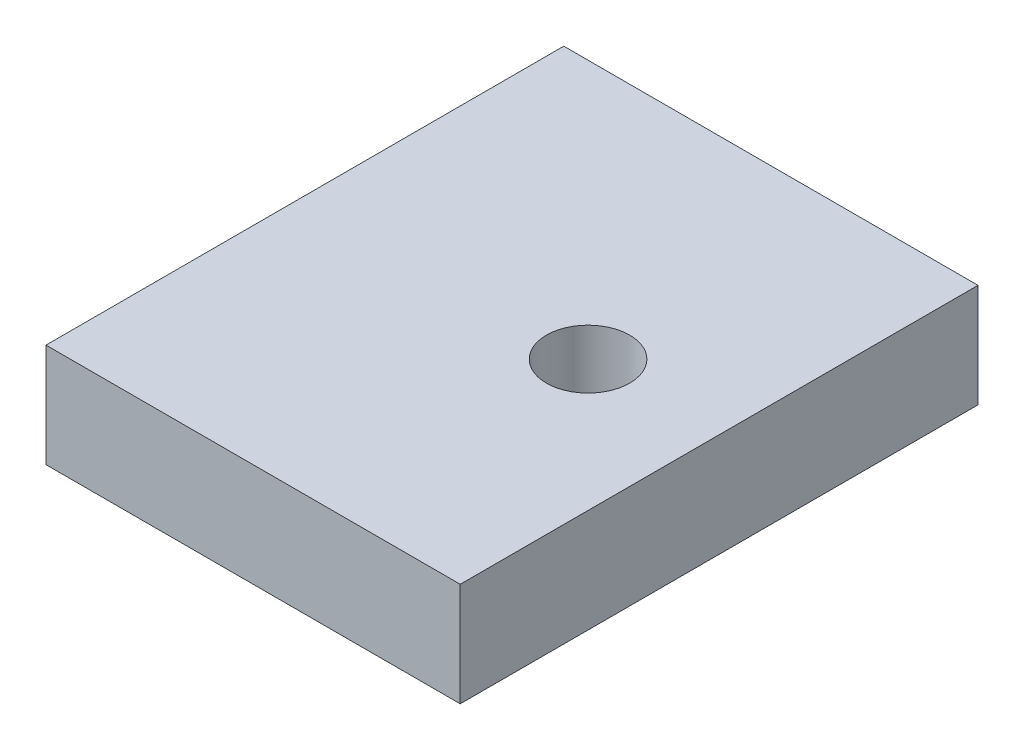
ISO-10303-21;
HEADER;
FILE_DESCRIPTION(('STEP AP214'),'2;1');
FILE_NAME('part.step','',(''),(''),'','','');
FILE_SCHEMA(('AUTOMOTIVE_DESIGN { 1 0 10303 214 1 1 1 1 }'));
ENDSEC;
DATA;
#1=APPLICATION_CONTEXT('core data for automotive mechanical design processes');
#2=APPLICATION_PROTOCOL_DEFINITION('international standard','automotive_design',2000,#1);
#3=PRODUCT_CONTEXT('',#1,'mechanical');
#4=PRODUCT('Part','Part','',(#3));
#5=PRODUCT_RELATED_PRODUCT_CATEGORY('part','',(#4));
#6=PRODUCT_DEFINITION_FORMATION('','',#4);
#7=PRODUCT_DEFINITION_CONTEXT('part definition',#1,'design');
#8=PRODUCT_DEFINITION('design','',#6,#7);
#9=PRODUCT_DEFINITION_SHAPE('','',#8);
#10=(LENGTH_UNIT() NAMED_UNIT(*) SI_UNIT(.MILLI.,.METRE.));
#11=(NAMED_UNIT(*) PLANE_ANGLE_UNIT() SI_UNIT($,.RADIAN.));
#12=(NAMED_UNIT(*) SI_UNIT($,.STERADIAN.) SOLID_ANGLE_UNIT());
#13=UNCERTAINTY_MEASURE_WITH_UNIT(LENGTH_MEASURE(1.E-05),#10,'distance_accuracy_value','');
#14=(GEOMETRIC_REPRESENTATION_CONTEXT(3) GLOBAL_UNCERTAINTY_ASSIGNED_CONTEXT((#13)) GLOBAL_UNIT_ASSIGNED_CONTEXT((#10,
#11,#12)) REPRESENTATION_CONTEXT('',''));
#15=CARTESIAN_POINT('',(0.,0.,0.));
#16=DIRECTION('',(0.,0.,1.));
#17=DIRECTION('',(1.,0.,0.));
#18=AXIS2_PLACEMENT_3D('',#15,#16,#17);
#19=CARTESIAN_POINT('',(25.4,6.35,0.));
#20=DIRECTION('',(1.,0.,0.));
#21=DIRECTION('',(0.,0.,-1.));
#22=AXIS2_PLACEMENT_3D('',#19,#20,#21);
#23=PLANE('',#22);
#24=DIRECTION('',(0.,0.,1.));
#25=VECTOR('',#24,1.);
#26=CARTESIAN_POINT('',(25.4,0.,0.));
#27=LINE('',#26,#25);
#28=CARTESIAN_POINT('',(25.4,0.,-31.75));
#29=VERTEX_POINT('',#28);
#30=CARTESIAN_POINT('',(25.4,0.,0.));
#31=VERTEX_POINT('',#30);
#32=EDGE_CURVE('E101',#29,#31,#27,.T.);
#33=ORIENTED_EDGE('',*,*,#32,.F.);
#34=DIRECTION('',(0.,-1.,0.));
#35=VECTOR('',#34,1.);
#36=CARTESIAN_POINT('',(25.4,6.35,-31.75));
#37=LINE('',#36,#35);
#38=CARTESIAN_POINT('',(25.4,6.35,-31.75));
#39=VERTEX_POINT('',#38);
#40=EDGE_CURVE('E11',#39,#29,#37,.T.);
#41=ORIENTED_EDGE('',*,*,#40,.F.);
#42=DIRECTION('',(0.,0.,1.));
#43=VECTOR('',#42,1.);
#44=CARTESIAN_POINT('',(25.4,6.35,0.));
#45=LINE('',#44,#43);
#46=CARTESIAN_POINT('',(25.4,6.35,0.));
#47=VERTEX_POINT('',#46);
#48=EDGE_CURVE('E94',#39,#47,#45,.T.);
#49=ORIENTED_EDGE('',*,*,#48,.T.);
#50=DIRECTION('',(0.,-1.,0.));
#51=VECTOR('',#50,1.);
#52=CARTESIAN_POINT('',(25.4,6.35,0.));
#53=LINE('',#52,#51);
#54=EDGE_CURVE('E75',#47,#31,#53,.T.);
#55=ORIENTED_EDGE('',*,*,#54,.T.);
#56=EDGE_LOOP('',(#33,#41,#49,#55));
#57=FACE_BOUND('',#56,.T.);
#58=ADVANCED_FACE('F36',(#57),#23,.T.);
#59=CARTESIAN_POINT('',(0.,6.35,-31.75));
#60=DIRECTION('',(0.,0.,-1.));
#61=DIRECTION('',(-1.,0.,0.));
#62=AXIS2_PLACEMENT_3D('',#59,#60,#61);
#63=PLANE('',#62);
#64=DIRECTION('',(1.,0.,0.));
#65=VECTOR('',#64,1.);
#66=CARTESIAN_POINT('',(0.,0.,-31.75));
#67=LINE('',#66,#65);
#68=CARTESIAN_POINT('',(0.,0.,-31.75));
#69=VERTEX_POINT('',#68);
#70=EDGE_CURVE('E86',#69,#29,#67,.T.);
#71=ORIENTED_EDGE('',*,*,#70,.F.);
#72=DIRECTION('',(0.,-1.,0.));
#73=VECTOR('',#72,1.);
#74=CARTESIAN_POINT('',(0.,6.35,-31.75));
#75=LINE('',#74,#73);
#76=CARTESIAN_POINT('',(0.,6.35,-31.75));
#77=VERTEX_POINT('',#76);
#78=EDGE_CURVE('E45',#77,#69,#75,.T.);
#79=ORIENTED_EDGE('',*,*,#78,.F.);
#80=DIRECTION('',(1.,0.,0.));
#81=VECTOR('',#80,1.);
#82=CARTESIAN_POINT('',(0.,6.35,-31.75));
#83=LINE('',#82,#81);
#84=EDGE_CURVE('E84',#77,#39,#83,.T.);
#85=ORIENTED_EDGE('',*,*,#84,.T.);
#86=ORIENTED_EDGE('',*,*,#40,.T.);
#87=EDGE_LOOP('',(#71,#79,#85,#86));
#88=FACE_BOUND('',#87,.T.);
#89=ADVANCED_FACE('F83',(#88),#63,.T.);
#90=CARTESIAN_POINT('',(0.,6.35,0.));
#91=DIRECTION('',(-1.,0.,0.));
#92=DIRECTION('',(0.,0.,1.));
#93=AXIS2_PLACEMENT_3D('',#90,#91,#92);
#94=PLANE('',#93);
#95=DIRECTION('',(0.,0.,-1.));
#96=VECTOR('',#95,1.);
#97=CARTESIAN_POINT('',(0.,0.,0.));
#98=LINE('',#97,#96);
#99=CARTESIAN_POINT('',(0.,0.,0.));
#100=VERTEX_POINT('',#99);
#101=EDGE_CURVE('E105',#100,#69,#98,.T.);
#102=ORIENTED_EDGE('',*,*,#101,.F.);
#103=DIRECTION('',(0.,-1.,0.));
#104=VECTOR('',#103,1.);
#105=CARTESIAN_POINT('',(0.,6.35,0.));
#106=LINE('',#105,#104);
#107=CARTESIAN_POINT('',(0.,6.35,0.));
#108=VERTEX_POINT('',#107);
#109=EDGE_CURVE('E68',#108,#100,#106,.T.);
#110=ORIENTED_EDGE('',*,*,#109,.F.);
#111=DIRECTION('',(0.,0.,-1.));
#112=VECTOR('',#111,1.);
#113=CARTESIAN_POINT('',(0.,6.35,0.));
#114=LINE('',#113,#112);
#115=EDGE_CURVE('E93',#108,#77,#114,.T.);
#116=ORIENTED_EDGE('',*,*,#115,.T.);
#117=ORIENTED_EDGE('',*,*,#78,.T.);
#118=EDGE_LOOP('',(#102,#110,#116,#117));
#119=FACE_BOUND('',#118,.T.);
#120=ADVANCED_FACE('F96',(#119),#94,.T.);
#121=CARTESIAN_POINT('',(0.,6.35,0.));
#122=DIRECTION('',(0.,0.,-1.));
#123=DIRECTION('',(-1.,0.,0.));
#124=AXIS2_PLACEMENT_3D('',#121,#122,#123);
#125=PLANE('',#124);
#126=DIRECTION('',(1.,0.,0.));
#127=VECTOR('',#126,1.);
#128=CARTESIAN_POINT('',(0.,0.,0.));
#129=LINE('',#128,#127);
#130=EDGE_CURVE('E107',#100,#31,#129,.T.);
#131=ORIENTED_EDGE('',*,*,#130,.T.);
#132=ORIENTED_EDGE('',*,*,#54,.F.);
#133=DIRECTION('',(1.,0.,0.));
#134=VECTOR('',#133,1.);
#135=CARTESIAN_POINT('',(0.,6.35,0.));
#136=LINE('',#135,#134);
#137=EDGE_CURVE('E53',#108,#47,#136,.T.);
#138=ORIENTED_EDGE('',*,*,#137,.F.);
#139=ORIENTED_EDGE('',*,*,#109,.T.);
#140=EDGE_LOOP('',(#131,#132,#138,#139));
#141=FACE_BOUND('',#140,.T.);
#142=ADVANCED_FACE('F137',(#141),#125,.F.);
#143=CARTESIAN_POINT('',(0.,6.35,0.));
#144=DIRECTION('',(0.,1.,0.));
#145=DIRECTION('',(0.,0.,1.));
#146=AXIS2_PLACEMENT_3D('',#143,#144,#145);
#147=PLANE('',#146);
#148=CARTESIAN_POINT('',(17.364456,6.35,-15.875));
#149=DIRECTION('',(0.,1.,0.));
#150=DIRECTION('',(0.,0.,1.));
#151=AXIS2_PLACEMENT_3D('',#148,#149,#150);
#152=CIRCLE('',#151,2.55269999999999);
#153=CARTESIAN_POINT('',(17.364456,6.35,-13.3223));
#154=VERTEX_POINT('',#153);
#155=EDGE_CURVE('E111',#154,#154,#152,.T.);
#156=ORIENTED_EDGE('',*,*,#155,.F.);
#157=EDGE_LOOP('',(#156));
#158=FACE_BOUND('',#157,.T.);
#159=ORIENTED_EDGE('',*,*,#48,.F.);
#160=ORIENTED_EDGE('',*,*,#84,.F.);
#161=ORIENTED_EDGE('',*,*,#115,.F.);
#162=ORIENTED_EDGE('',*,*,#137,.T.);
#163=EDGE_LOOP('',(#159,#160,#161,#162));
#164=FACE_BOUND('',#163,.T.);
#165=ADVANCED_FACE('F92',(#158,#164),#147,.T.);
#166=CARTESIAN_POINT('',(0.,0.,0.));
#167=DIRECTION('',(0.,1.,0.));
#168=DIRECTION('',(0.,0.,1.));
#169=AXIS2_PLACEMENT_3D('',#166,#167,#168);
#170=PLANE('',#169);
#171=CARTESIAN_POINT('',(17.364456,0.,-15.875));
#172=DIRECTION('',(0.,1.,0.));
#173=DIRECTION('',(0.,0.,1.));
#174=AXIS2_PLACEMENT_3D('',#171,#172,#173);
#175=CIRCLE('',#174,2.55269999999999);
#176=CARTESIAN_POINT('',(17.364456,0.,-13.3223));
#177=VERTEX_POINT('',#176);
#178=EDGE_CURVE('E39',#177,#177,#175,.T.);
#179=ORIENTED_EDGE('',*,*,#178,.T.);
#180=EDGE_LOOP('',(#179));
#181=FACE_BOUND('',#180,.T.);
#182=ORIENTED_EDGE('',*,*,#32,.T.);
#183=ORIENTED_EDGE('',*,*,#130,.F.);
#184=ORIENTED_EDGE('',*,*,#101,.T.);
#185=ORIENTED_EDGE('',*,*,#70,.T.);
#186=EDGE_LOOP('',(#182,#183,#184,#185));
#187=FACE_BOUND('',#186,.T.);
#188=ADVANCED_FACE('F118',(#181,#187),#170,.F.);
#189=CARTESIAN_POINT('',(17.364456,6.35,-15.875));
#190=DIRECTION('',(0.,1.,0.));
#191=DIRECTION('',(0.,0.,1.));
#192=AXIS2_PLACEMENT_3D('',#189,#190,#191);
#193=CYLINDRICAL_SURFACE('',#192,2.55269999999999);
#194=ORIENTED_EDGE('',*,*,#155,.T.);
#195=EDGE_LOOP('',(#194));
#196=FACE_BOUND('',#195,.T.);
#197=ORIENTED_EDGE('',*,*,#178,.F.);
#198=EDGE_LOOP('',(#197));
#199=FACE_BOUND('',#198,.T.);
#200=ADVANCED_FACE('F121',(#196,#199),#193,.F.);
#201=CLOSED_SHELL('',(#58,#89,#120,#142,#165,#188,#200));
#202=MANIFOLD_SOLID_BREP('B2',#201);
#203=ADVANCED_BREP_SHAPE_REPRESENTATION('',(#18,#202),#14);
#204=SHAPE_DEFINITION_REPRESENTATION(#9,#203);
ENDSEC;
END-ISO-10303-21;
